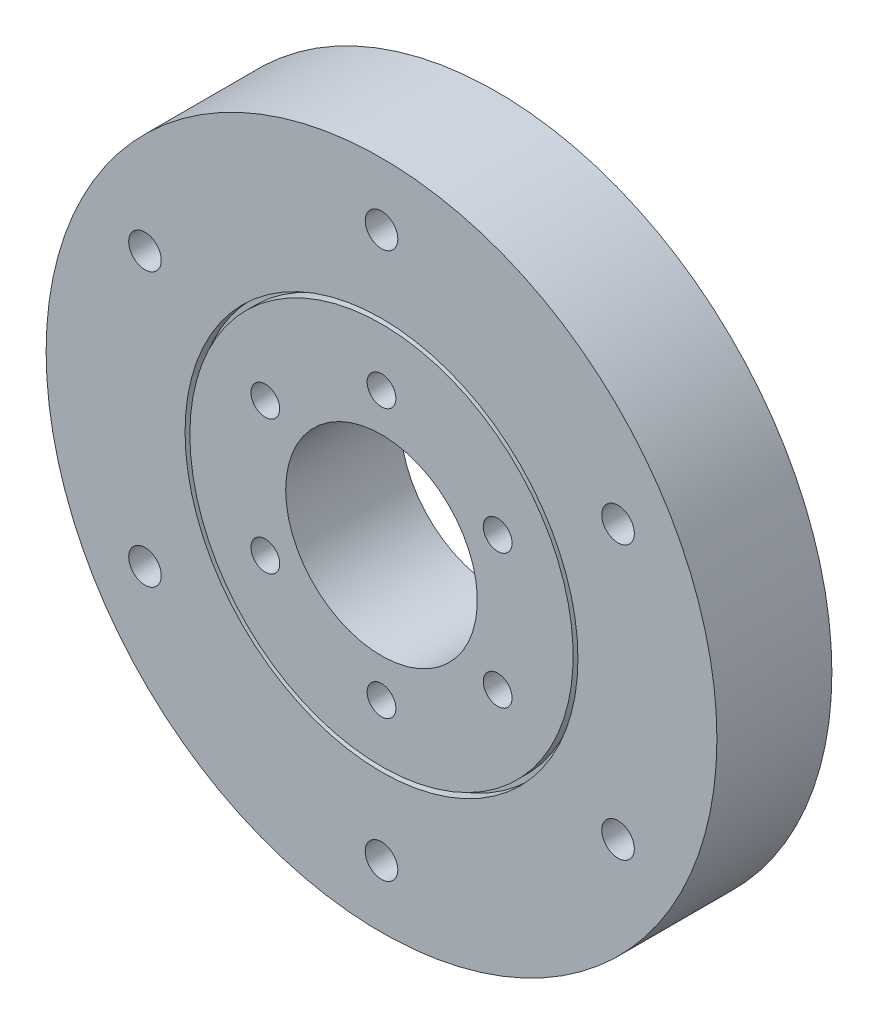
ISO-10303-21;
HEADER;
FILE_DESCRIPTION(('STEP AP214'),'2;1');
FILE_NAME('part.step','',(''),(''),'','','');
FILE_SCHEMA(('AUTOMOTIVE_DESIGN { 1 0 10303 214 1 1 1 1 }'));
ENDSEC;
DATA;
#1=APPLICATION_CONTEXT('core data for automotive mechanical design processes');
#2=APPLICATION_PROTOCOL_DEFINITION('international standard','automotive_design',2000,#1);
#3=PRODUCT_CONTEXT('',#1,'mechanical');
#4=PRODUCT('Part','Part','',(#3));
#5=PRODUCT_RELATED_PRODUCT_CATEGORY('part','',(#4));
#6=PRODUCT_DEFINITION_FORMATION('','',#4);
#7=PRODUCT_DEFINITION_CONTEXT('part definition',#1,'design');
#8=PRODUCT_DEFINITION('design','',#6,#7);
#9=PRODUCT_DEFINITION_SHAPE('','',#8);
#10=(LENGTH_UNIT() NAMED_UNIT(*) SI_UNIT(.MILLI.,.METRE.));
#11=(NAMED_UNIT(*) PLANE_ANGLE_UNIT() SI_UNIT($,.RADIAN.));
#12=(NAMED_UNIT(*) SI_UNIT($,.STERADIAN.) SOLID_ANGLE_UNIT());
#13=UNCERTAINTY_MEASURE_WITH_UNIT(LENGTH_MEASURE(1.E-05),#10,'distance_accuracy_value','');
#14=(GEOMETRIC_REPRESENTATION_CONTEXT(3) GLOBAL_UNCERTAINTY_ASSIGNED_CONTEXT((#13)) GLOBAL_UNIT_ASSIGNED_CONTEXT((#10,
#11,#12)) REPRESENTATION_CONTEXT('',''));
#15=CARTESIAN_POINT('',(0.,0.,0.));
#16=DIRECTION('',(0.,0.,1.));
#17=DIRECTION('',(1.,0.,0.));
#18=AXIS2_PLACEMENT_3D('',#15,#16,#17);
#19=CARTESIAN_POINT('',(0.,0.,-11.2234597048574));
#20=DIRECTION('',(0.,0.,-1.));
#21=DIRECTION('',(-1.,0.,0.));
#22=AXIS2_PLACEMENT_3D('',#19,#20,#21);
#23=CYLINDRICAL_SURFACE('',#22,35.);
#24=CARTESIAN_POINT('',(0.,0.,-6.));
#25=DIRECTION('',(0.,0.,-1.));
#26=DIRECTION('',(-1.,0.,0.));
#27=AXIS2_PLACEMENT_3D('',#24,#25,#26);
#28=CIRCLE('',#27,35.);
#29=CARTESIAN_POINT('',(-35.,0.,-6.));
#30=VERTEX_POINT('',#29);
#31=EDGE_CURVE('E10',#30,#30,#28,.T.);
#32=ORIENTED_EDGE('',*,*,#31,.F.);
#33=EDGE_LOOP('',(#32));
#34=FACE_BOUND('',#33,.T.);
#35=CARTESIAN_POINT('',(0.,0.,6.));
#36=DIRECTION('',(0.,0.,-1.));
#37=DIRECTION('',(-1.,0.,0.));
#38=AXIS2_PLACEMENT_3D('',#35,#36,#37);
#39=CIRCLE('',#38,35.);
#40=CARTESIAN_POINT('',(-35.,0.,6.));
#41=VERTEX_POINT('',#40);
#42=EDGE_CURVE('E73',#41,#41,#39,.T.);
#43=ORIENTED_EDGE('',*,*,#42,.T.);
#44=EDGE_LOOP('',(#43));
#45=FACE_BOUND('',#44,.T.);
#46=ADVANCED_FACE('F33',(#34,#45),#23,.T.);
#47=CARTESIAN_POINT('',(20.5,0.,-6.));
#48=DIRECTION('',(0.,0.,1.));
#49=DIRECTION('',(1.,0.,0.));
#50=AXIS2_PLACEMENT_3D('',#47,#48,#49);
#51=PLANE('',#50);
#52=CARTESIAN_POINT('',(0.,28.5,-6.));
#53=DIRECTION('',(0.,0.,-1.));
#54=DIRECTION('',(-1.,0.,0.));
#55=AXIS2_PLACEMENT_3D('',#52,#53,#54);
#56=CIRCLE('',#55,1.7);
#57=CARTESIAN_POINT('',(-1.7,28.5,-6.));
#58=VERTEX_POINT('',#57);
#59=EDGE_CURVE('E100',#58,#58,#56,.T.);
#60=ORIENTED_EDGE('',*,*,#59,.F.);
#61=EDGE_LOOP('',(#60));
#62=FACE_BOUND('',#61,.T.);
#63=CARTESIAN_POINT('',(24.6817240078559,14.2499999999989,-6.));
#64=DIRECTION('',(0.,0.,-1.));
#65=DIRECTION('',(-1.,0.,0.));
#66=AXIS2_PLACEMENT_3D('',#63,#64,#65);
#67=CIRCLE('',#66,1.70000000000122);
#68=CARTESIAN_POINT('',(22.9817240078547,14.2499999999989,-6.));
#69=VERTEX_POINT('',#68);
#70=EDGE_CURVE('E131',#69,#69,#67,.T.);
#71=ORIENTED_EDGE('',*,*,#70,.F.);
#72=EDGE_LOOP('',(#71));
#73=FACE_BOUND('',#72,.T.);
#74=CARTESIAN_POINT('',(24.6817240078547,-14.2500000000011,-6.));
#75=DIRECTION('',(0.,0.,-1.));
#76=DIRECTION('',(-1.,0.,0.));
#77=AXIS2_PLACEMENT_3D('',#74,#75,#76);
#78=CIRCLE('',#77,1.7000000000023);
#79=CARTESIAN_POINT('',(22.9817240078524,-14.2500000000011,-6.));
#80=VERTEX_POINT('',#79);
#81=EDGE_CURVE('E130',#80,#80,#78,.T.);
#82=ORIENTED_EDGE('',*,*,#81,.F.);
#83=EDGE_LOOP('',(#82));
#84=FACE_BOUND('',#83,.T.);
#85=CARTESIAN_POINT('',(-2.41958542616683E-12,-28.5,-6.));
#86=DIRECTION('',(0.,0.,-1.));
#87=DIRECTION('',(-1.,0.,0.));
#88=AXIS2_PLACEMENT_3D('',#85,#86,#87);
#89=CIRCLE('',#88,1.7000000000025);
#90=CARTESIAN_POINT('',(-1.70000000000492,-28.5,-6.));
#91=VERTEX_POINT('',#90);
#92=EDGE_CURVE('E137',#91,#91,#89,.T.);
#93=ORIENTED_EDGE('',*,*,#92,.F.);
#94=EDGE_LOOP('',(#93));
#95=FACE_BOUND('',#94,.T.);
#96=CARTESIAN_POINT('',(-24.6817240078571,14.2500000000011,-6.));
#97=DIRECTION('',(0.,0.,-1.));
#98=DIRECTION('',(-1.,0.,0.));
#99=AXIS2_PLACEMENT_3D('',#96,#97,#98);
#100=CIRCLE('',#99,1.70000000000034);
#101=CARTESIAN_POINT('',(-26.3817240078574,14.2500000000011,-6.));
#102=VERTEX_POINT('',#101);
#103=EDGE_CURVE('E106',#102,#102,#100,.T.);
#104=ORIENTED_EDGE('',*,*,#103,.F.);
#105=EDGE_LOOP('',(#104));
#106=FACE_BOUND('',#105,.T.);
#107=CARTESIAN_POINT('',(-24.6817240078583,-14.2499999999989,-6.));
#108=DIRECTION('',(0.,0.,-1.));
#109=DIRECTION('',(-1.,0.,0.));
#110=AXIS2_PLACEMENT_3D('',#107,#108,#109);
#111=CIRCLE('',#110,1.70000000000156);
#112=CARTESIAN_POINT('',(-26.3817240078599,-14.2499999999989,-6.));
#113=VERTEX_POINT('',#112);
#114=EDGE_CURVE('E107',#113,#113,#111,.T.);
#115=ORIENTED_EDGE('',*,*,#114,.F.);
#116=EDGE_LOOP('',(#115));
#117=FACE_BOUND('',#116,.T.);
#118=CARTESIAN_POINT('',(0.,0.,-6.));
#119=DIRECTION('',(0.,0.,-1.));
#120=DIRECTION('',(-1.,0.,0.));
#121=AXIS2_PLACEMENT_3D('',#118,#119,#120);
#122=CIRCLE('',#121,20.5);
#123=CARTESIAN_POINT('',(-20.5,0.,-6.));
#124=VERTEX_POINT('',#123);
#125=EDGE_CURVE('E39',#124,#124,#122,.T.);
#126=ORIENTED_EDGE('',*,*,#125,.F.);
#127=EDGE_LOOP('',(#126));
#128=FACE_BOUND('',#127,.T.);
#129=ORIENTED_EDGE('',*,*,#31,.T.);
#130=EDGE_LOOP('',(#129));
#131=FACE_BOUND('',#130,.T.);
#132=ADVANCED_FACE('F152',(#62,#73,#84,#95,#106,#117,#128,#131),#51,.F.);
#133=CARTESIAN_POINT('',(0.,0.,-11.2234597048574));
#134=DIRECTION('',(0.,0.,-1.));
#135=DIRECTION('',(-1.,0.,0.));
#136=AXIS2_PLACEMENT_3D('',#133,#134,#135);
#137=CYLINDRICAL_SURFACE('',#136,20.5);
#138=CARTESIAN_POINT('',(0.,0.,-5.));
#139=DIRECTION('',(0.,0.,-1.));
#140=DIRECTION('',(-1.,0.,0.));
#141=AXIS2_PLACEMENT_3D('',#138,#139,#140);
#142=CIRCLE('',#141,20.5);
#143=CARTESIAN_POINT('',(-20.5,0.,-5.));
#144=VERTEX_POINT('',#143);
#145=EDGE_CURVE('E43',#144,#144,#142,.T.);
#146=ORIENTED_EDGE('',*,*,#145,.F.);
#147=EDGE_LOOP('',(#146));
#148=FACE_BOUND('',#147,.T.);
#149=ORIENTED_EDGE('',*,*,#125,.T.);
#150=EDGE_LOOP('',(#149));
#151=FACE_BOUND('',#150,.T.);
#152=ADVANCED_FACE('F155',(#148,#151),#137,.F.);
#153=CARTESIAN_POINT('',(20.,0.,-5.));
#154=DIRECTION('',(0.,0.,1.));
#155=DIRECTION('',(1.,0.,0.));
#156=AXIS2_PLACEMENT_3D('',#153,#154,#155);
#157=PLANE('',#156);
#158=CARTESIAN_POINT('',(0.,0.,-5.));
#159=DIRECTION('',(0.,0.,-1.));
#160=DIRECTION('',(-1.,0.,0.));
#161=AXIS2_PLACEMENT_3D('',#158,#159,#160);
#162=CIRCLE('',#161,20.);
#163=CARTESIAN_POINT('',(-20.,0.,-5.));
#164=VERTEX_POINT('',#163);
#165=EDGE_CURVE('E47',#164,#164,#162,.T.);
#166=ORIENTED_EDGE('',*,*,#165,.F.);
#167=EDGE_LOOP('',(#166));
#168=FACE_BOUND('',#167,.T.);
#169=ORIENTED_EDGE('',*,*,#145,.T.);
#170=EDGE_LOOP('',(#169));
#171=FACE_BOUND('',#170,.T.);
#172=ADVANCED_FACE('F224',(#168,#171),#157,.F.);
#173=CARTESIAN_POINT('',(0.,0.,-11.2234597048574));
#174=DIRECTION('',(0.,0.,-1.));
#175=DIRECTION('',(-1.,0.,0.));
#176=AXIS2_PLACEMENT_3D('',#173,#174,#175);
#177=CYLINDRICAL_SURFACE('',#176,20.);
#178=CARTESIAN_POINT('',(0.,0.,-6.));
#179=DIRECTION('',(0.,0.,-1.));
#180=DIRECTION('',(-1.,0.,0.));
#181=AXIS2_PLACEMENT_3D('',#178,#179,#180);
#182=CIRCLE('',#181,20.);
#183=CARTESIAN_POINT('',(-20.,0.,-6.));
#184=VERTEX_POINT('',#183);
#185=EDGE_CURVE('E52',#184,#184,#182,.T.);
#186=ORIENTED_EDGE('',*,*,#185,.F.);
#187=EDGE_LOOP('',(#186));
#188=FACE_BOUND('',#187,.T.);
#189=ORIENTED_EDGE('',*,*,#165,.T.);
#190=EDGE_LOOP('',(#189));
#191=FACE_BOUND('',#190,.T.);
#192=ADVANCED_FACE('F217',(#188,#191),#177,.T.);
#193=CARTESIAN_POINT('',(10.,0.,-6.));
#194=DIRECTION('',(0.,0.,1.));
#195=DIRECTION('',(1.,0.,0.));
#196=AXIS2_PLACEMENT_3D('',#193,#194,#195);
#197=PLANE('',#196);
#198=CARTESIAN_POINT('',(0.,14.,-6.));
#199=DIRECTION('',(0.,0.,-1.));
#200=DIRECTION('',(-1.,0.,0.));
#201=AXIS2_PLACEMENT_3D('',#198,#199,#200);
#202=CIRCLE('',#201,1.5);
#203=CARTESIAN_POINT('',(-1.5,14.,-6.));
#204=VERTEX_POINT('',#203);
#205=EDGE_CURVE('E94',#204,#204,#202,.T.);
#206=ORIENTED_EDGE('',*,*,#205,.F.);
#207=EDGE_LOOP('',(#206));
#208=FACE_BOUND('',#207,.T.);
#209=CARTESIAN_POINT('',(-12.1243556529822,6.99999999999997,-6.));
#210=DIRECTION('',(0.,0.,-1.));
#211=DIRECTION('',(-1.,0.,0.));
#212=AXIS2_PLACEMENT_3D('',#209,#210,#211);
#213=CIRCLE('',#212,1.5);
#214=CARTESIAN_POINT('',(-13.6243556529822,6.99999999999997,-6.));
#215=VERTEX_POINT('',#214);
#216=EDGE_CURVE('E88',#215,#215,#213,.T.);
#217=ORIENTED_EDGE('',*,*,#216,.F.);
#218=EDGE_LOOP('',(#217));
#219=FACE_BOUND('',#218,.T.);
#220=CARTESIAN_POINT('',(-12.124355652983,-6.99999999999948,-6.));
#221=DIRECTION('',(0.,0.,-1.));
#222=DIRECTION('',(-1.,0.,0.));
#223=AXIS2_PLACEMENT_3D('',#220,#221,#222);
#224=CIRCLE('',#223,1.50000000000077);
#225=CARTESIAN_POINT('',(-13.6243556529838,-6.99999999999948,-6.));
#226=VERTEX_POINT('',#225);
#227=EDGE_CURVE('E80',#226,#226,#224,.T.);
#228=ORIENTED_EDGE('',*,*,#227,.F.);
#229=EDGE_LOOP('',(#228));
#230=FACE_BOUND('',#229,.T.);
#231=CARTESIAN_POINT('',(-1.18856827952055E-12,-14.,-6.));
#232=DIRECTION('',(0.,0.,-1.));
#233=DIRECTION('',(-1.,0.,0.));
#234=AXIS2_PLACEMENT_3D('',#231,#232,#233);
#235=CIRCLE('',#234,1.50000000000123);
#236=CARTESIAN_POINT('',(-1.50000000000242,-14.,-6.));
#237=VERTEX_POINT('',#236);
#238=EDGE_CURVE('E81',#237,#237,#235,.T.);
#239=ORIENTED_EDGE('',*,*,#238,.F.);
#240=EDGE_LOOP('',(#239));
#241=FACE_BOUND('',#240,.T.);
#242=CARTESIAN_POINT('',(12.1243556529812,-7.00000000000052,-6.));
#243=DIRECTION('',(0.,0.,-1.));
#244=DIRECTION('',(-1.,0.,0.));
#245=AXIS2_PLACEMENT_3D('',#242,#243,#244);
#246=CIRCLE('',#245,1.50000000000113);
#247=CARTESIAN_POINT('',(10.6243556529801,-7.00000000000052,-6.));
#248=VERTEX_POINT('',#247);
#249=EDGE_CURVE('E120',#248,#248,#246,.T.);
#250=ORIENTED_EDGE('',*,*,#249,.F.);
#251=EDGE_LOOP('',(#250));
#252=FACE_BOUND('',#251,.T.);
#253=CARTESIAN_POINT('',(12.1243556529819,6.99999999999948,-6.));
#254=DIRECTION('',(0.,0.,-1.));
#255=DIRECTION('',(-1.,0.,0.));
#256=AXIS2_PLACEMENT_3D('',#253,#254,#255);
#257=CIRCLE('',#256,1.5000000000006);
#258=CARTESIAN_POINT('',(10.6243556529813,6.99999999999948,-6.));
#259=VERTEX_POINT('',#258);
#260=EDGE_CURVE('E114',#259,#259,#257,.T.);
#261=ORIENTED_EDGE('',*,*,#260,.F.);
#262=EDGE_LOOP('',(#261));
#263=FACE_BOUND('',#262,.T.);
#264=CARTESIAN_POINT('',(0.,0.,-6.));
#265=DIRECTION('',(0.,0.,-1.));
#266=DIRECTION('',(-1.,0.,0.));
#267=AXIS2_PLACEMENT_3D('',#264,#265,#266);
#268=CIRCLE('',#267,10.);
#269=CARTESIAN_POINT('',(-10.,0.,-6.));
#270=VERTEX_POINT('',#269);
#271=EDGE_CURVE('E55',#270,#270,#268,.T.);
#272=ORIENTED_EDGE('',*,*,#271,.F.);
#273=EDGE_LOOP('',(#272));
#274=FACE_BOUND('',#273,.T.);
#275=ORIENTED_EDGE('',*,*,#185,.T.);
#276=EDGE_LOOP('',(#275));
#277=FACE_BOUND('',#276,.T.);
#278=ADVANCED_FACE('F211',(#208,#219,#230,#241,#252,#263,#274,#277),#197,.F.);
#279=CARTESIAN_POINT('',(0.,0.,-11.2234597048574));
#280=DIRECTION('',(0.,0.,-1.));
#281=DIRECTION('',(-1.,0.,0.));
#282=AXIS2_PLACEMENT_3D('',#279,#280,#281);
#283=CYLINDRICAL_SURFACE('',#282,10.);
#284=CARTESIAN_POINT('',(0.,0.,5.99999999999999));
#285=DIRECTION('',(0.,0.,-1.));
#286=DIRECTION('',(-1.,0.,0.));
#287=AXIS2_PLACEMENT_3D('',#284,#285,#286);
#288=CIRCLE('',#287,10.);
#289=CARTESIAN_POINT('',(-10.,0.,5.99999999999999));
#290=VERTEX_POINT('',#289);
#291=EDGE_CURVE('E58',#290,#290,#288,.T.);
#292=ORIENTED_EDGE('',*,*,#291,.F.);
#293=EDGE_LOOP('',(#292));
#294=FACE_BOUND('',#293,.T.);
#295=ORIENTED_EDGE('',*,*,#271,.T.);
#296=EDGE_LOOP('',(#295));
#297=FACE_BOUND('',#296,.T.);
#298=ADVANCED_FACE('F204',(#294,#297),#283,.F.);
#299=CARTESIAN_POINT('',(10.,0.,6.));
#300=DIRECTION('',(0.,0.,-1.));
#301=DIRECTION('',(-1.,0.,0.));
#302=AXIS2_PLACEMENT_3D('',#299,#300,#301);
#303=PLANE('',#302);
#304=CARTESIAN_POINT('',(0.,14.,6.));
#305=DIRECTION('',(0.,0.,-1.));
#306=DIRECTION('',(-1.,0.,0.));
#307=AXIS2_PLACEMENT_3D('',#304,#305,#306);
#308=CIRCLE('',#307,1.5);
#309=CARTESIAN_POINT('',(-1.5,14.,6.));
#310=VERTEX_POINT('',#309);
#311=EDGE_CURVE('E97',#310,#310,#308,.F.);
#312=ORIENTED_EDGE('',*,*,#311,.F.);
#313=EDGE_LOOP('',(#312));
#314=FACE_BOUND('',#313,.T.);
#315=CARTESIAN_POINT('',(-12.1243556529822,6.99999999999997,6.));
#316=DIRECTION('',(0.,0.,-1.));
#317=DIRECTION('',(-1.,0.,0.));
#318=AXIS2_PLACEMENT_3D('',#315,#316,#317);
#319=CIRCLE('',#318,1.5);
#320=CARTESIAN_POINT('',(-13.6243556529822,6.99999999999997,6.));
#321=VERTEX_POINT('',#320);
#322=EDGE_CURVE('E91',#321,#321,#319,.F.);
#323=ORIENTED_EDGE('',*,*,#322,.F.);
#324=EDGE_LOOP('',(#323));
#325=FACE_BOUND('',#324,.T.);
#326=CARTESIAN_POINT('',(-12.124355652983,-6.99999999999948,6.));
#327=DIRECTION('',(0.,0.,-1.));
#328=DIRECTION('',(-1.,0.,0.));
#329=AXIS2_PLACEMENT_3D('',#326,#327,#328);
#330=CIRCLE('',#329,1.50000000000077);
#331=CARTESIAN_POINT('',(-13.6243556529838,-6.99999999999948,6.));
#332=VERTEX_POINT('',#331);
#333=EDGE_CURVE('E85',#332,#332,#330,.F.);
#334=ORIENTED_EDGE('',*,*,#333,.F.);
#335=EDGE_LOOP('',(#334));
#336=FACE_BOUND('',#335,.T.);
#337=CARTESIAN_POINT('',(-1.18856827952055E-12,-14.,6.));
#338=DIRECTION('',(0.,0.,-1.));
#339=DIRECTION('',(-1.,0.,0.));
#340=AXIS2_PLACEMENT_3D('',#337,#338,#339);
#341=CIRCLE('',#340,1.50000000000123);
#342=CARTESIAN_POINT('',(-1.50000000000242,-14.,6.));
#343=VERTEX_POINT('',#342);
#344=EDGE_CURVE('E77',#343,#343,#341,.F.);
#345=ORIENTED_EDGE('',*,*,#344,.F.);
#346=EDGE_LOOP('',(#345));
#347=FACE_BOUND('',#346,.T.);
#348=CARTESIAN_POINT('',(12.1243556529812,-7.00000000000052,6.));
#349=DIRECTION('',(0.,0.,-1.));
#350=DIRECTION('',(-1.,0.,0.));
#351=AXIS2_PLACEMENT_3D('',#348,#349,#350);
#352=CIRCLE('',#351,1.50000000000113);
#353=CARTESIAN_POINT('',(10.6243556529801,-7.00000000000052,6.));
#354=VERTEX_POINT('',#353);
#355=EDGE_CURVE('E84',#354,#354,#352,.F.);
#356=ORIENTED_EDGE('',*,*,#355,.F.);
#357=EDGE_LOOP('',(#356));
#358=FACE_BOUND('',#357,.T.);
#359=CARTESIAN_POINT('',(12.1243556529819,6.99999999999948,6.));
#360=DIRECTION('',(0.,0.,-1.));
#361=DIRECTION('',(-1.,0.,0.));
#362=AXIS2_PLACEMENT_3D('',#359,#360,#361);
#363=CIRCLE('',#362,1.5000000000006);
#364=CARTESIAN_POINT('',(10.6243556529813,6.99999999999948,6.));
#365=VERTEX_POINT('',#364);
#366=EDGE_CURVE('E117',#365,#365,#363,.F.);
#367=ORIENTED_EDGE('',*,*,#366,.F.);
#368=EDGE_LOOP('',(#367));
#369=FACE_BOUND('',#368,.T.);
#370=CARTESIAN_POINT('',(0.,0.,5.99999999999999));
#371=DIRECTION('',(0.,0.,-1.));
#372=DIRECTION('',(-1.,0.,0.));
#373=AXIS2_PLACEMENT_3D('',#370,#371,#372);
#374=CIRCLE('',#373,20.);
#375=CARTESIAN_POINT('',(-20.,0.,5.99999999999999));
#376=VERTEX_POINT('',#375);
#377=EDGE_CURVE('E61',#376,#376,#374,.T.);
#378=ORIENTED_EDGE('',*,*,#377,.F.);
#379=EDGE_LOOP('',(#378));
#380=FACE_BOUND('',#379,.T.);
#381=ORIENTED_EDGE('',*,*,#291,.T.);
#382=EDGE_LOOP('',(#381));
#383=FACE_BOUND('',#382,.T.);
#384=ADVANCED_FACE('F198',(#314,#325,#336,#347,#358,#369,#380,#383),#303,.F.);
#385=CARTESIAN_POINT('',(0.,0.,-11.2234597048574));
#386=DIRECTION('',(0.,0.,-1.));
#387=DIRECTION('',(-1.,0.,0.));
#388=AXIS2_PLACEMENT_3D('',#385,#386,#387);
#389=CYLINDRICAL_SURFACE('',#388,20.);
#390=CARTESIAN_POINT('',(0.,0.,5.));
#391=DIRECTION('',(0.,0.,-1.));
#392=DIRECTION('',(-1.,0.,0.));
#393=AXIS2_PLACEMENT_3D('',#390,#391,#392);
#394=CIRCLE('',#393,20.);
#395=CARTESIAN_POINT('',(-20.,0.,5.));
#396=VERTEX_POINT('',#395);
#397=EDGE_CURVE('E64',#396,#396,#394,.T.);
#398=ORIENTED_EDGE('',*,*,#397,.F.);
#399=EDGE_LOOP('',(#398));
#400=FACE_BOUND('',#399,.T.);
#401=ORIENTED_EDGE('',*,*,#377,.T.);
#402=EDGE_LOOP('',(#401));
#403=FACE_BOUND('',#402,.T.);
#404=ADVANCED_FACE('F192',(#400,#403),#389,.T.);
#405=CARTESIAN_POINT('',(20.,0.,5.));
#406=DIRECTION('',(0.,0.,-1.));
#407=DIRECTION('',(-1.,0.,0.));
#408=AXIS2_PLACEMENT_3D('',#405,#406,#407);
#409=PLANE('',#408);
#410=CARTESIAN_POINT('',(0.,0.,5.));
#411=DIRECTION('',(0.,0.,-1.));
#412=DIRECTION('',(-1.,0.,0.));
#413=AXIS2_PLACEMENT_3D('',#410,#411,#412);
#414=CIRCLE('',#413,20.5);
#415=CARTESIAN_POINT('',(-20.5,0.,5.));
#416=VERTEX_POINT('',#415);
#417=EDGE_CURVE('E67',#416,#416,#414,.T.);
#418=ORIENTED_EDGE('',*,*,#417,.F.);
#419=EDGE_LOOP('',(#418));
#420=FACE_BOUND('',#419,.T.);
#421=ORIENTED_EDGE('',*,*,#397,.T.);
#422=EDGE_LOOP('',(#421));
#423=FACE_BOUND('',#422,.T.);
#424=ADVANCED_FACE('F186',(#420,#423),#409,.F.);
#425=CARTESIAN_POINT('',(0.,0.,-11.2234597048574));
#426=DIRECTION('',(0.,0.,-1.));
#427=DIRECTION('',(-1.,0.,0.));
#428=AXIS2_PLACEMENT_3D('',#425,#426,#427);
#429=CYLINDRICAL_SURFACE('',#428,20.5);
#430=CARTESIAN_POINT('',(0.,0.,6.));
#431=DIRECTION('',(0.,0.,-1.));
#432=DIRECTION('',(-1.,0.,0.));
#433=AXIS2_PLACEMENT_3D('',#430,#431,#432);
#434=CIRCLE('',#433,20.5);
#435=CARTESIAN_POINT('',(-20.5,0.,6.));
#436=VERTEX_POINT('',#435);
#437=EDGE_CURVE('E70',#436,#436,#434,.T.);
#438=ORIENTED_EDGE('',*,*,#437,.F.);
#439=EDGE_LOOP('',(#438));
#440=FACE_BOUND('',#439,.T.);
#441=ORIENTED_EDGE('',*,*,#417,.T.);
#442=EDGE_LOOP('',(#441));
#443=FACE_BOUND('',#442,.T.);
#444=ADVANCED_FACE('F177',(#440,#443),#429,.F.);
#445=CARTESIAN_POINT('',(20.5,0.,6.));
#446=DIRECTION('',(0.,0.,-1.));
#447=DIRECTION('',(-1.,0.,0.));
#448=AXIS2_PLACEMENT_3D('',#445,#446,#447);
#449=PLANE('',#448);
#450=CARTESIAN_POINT('',(0.,28.5,6.));
#451=DIRECTION('',(0.,0.,-1.));
#452=DIRECTION('',(-1.,0.,0.));
#453=AXIS2_PLACEMENT_3D('',#450,#451,#452);
#454=CIRCLE('',#453,1.7);
#455=CARTESIAN_POINT('',(-1.7,28.5,6.));
#456=VERTEX_POINT('',#455);
#457=EDGE_CURVE('E76',#456,#456,#454,.F.);
#458=ORIENTED_EDGE('',*,*,#457,.F.);
#459=EDGE_LOOP('',(#458));
#460=FACE_BOUND('',#459,.T.);
#461=CARTESIAN_POINT('',(24.6817240078559,14.2499999999989,6.));
#462=DIRECTION('',(0.,0.,-1.));
#463=DIRECTION('',(-1.,0.,0.));
#464=AXIS2_PLACEMENT_3D('',#461,#462,#463);
#465=CIRCLE('',#464,1.70000000000122);
#466=CARTESIAN_POINT('',(22.9817240078547,14.2499999999989,6.));
#467=VERTEX_POINT('',#466);
#468=EDGE_CURVE('E127',#467,#467,#465,.F.);
#469=ORIENTED_EDGE('',*,*,#468,.F.);
#470=EDGE_LOOP('',(#469));
#471=FACE_BOUND('',#470,.T.);
#472=CARTESIAN_POINT('',(24.6817240078547,-14.2500000000011,6.));
#473=DIRECTION('',(0.,0.,-1.));
#474=DIRECTION('',(-1.,0.,0.));
#475=AXIS2_PLACEMENT_3D('',#472,#473,#474);
#476=CIRCLE('',#475,1.7000000000023);
#477=CARTESIAN_POINT('',(22.9817240078524,-14.2500000000011,6.));
#478=VERTEX_POINT('',#477);
#479=EDGE_CURVE('E134',#478,#478,#476,.F.);
#480=ORIENTED_EDGE('',*,*,#479,.F.);
#481=EDGE_LOOP('',(#480));
#482=FACE_BOUND('',#481,.T.);
#483=CARTESIAN_POINT('',(-2.41958542616683E-12,-28.5,6.));
#484=DIRECTION('',(0.,0.,-1.));
#485=DIRECTION('',(-1.,0.,0.));
#486=AXIS2_PLACEMENT_3D('',#483,#484,#485);
#487=CIRCLE('',#486,1.7000000000025);
#488=CARTESIAN_POINT('',(-1.70000000000492,-28.5,6.));
#489=VERTEX_POINT('',#488);
#490=EDGE_CURVE('E110',#489,#489,#487,.F.);
#491=ORIENTED_EDGE('',*,*,#490,.F.);
#492=EDGE_LOOP('',(#491));
#493=FACE_BOUND('',#492,.T.);
#494=CARTESIAN_POINT('',(-24.6817240078571,14.2500000000011,6.));
#495=DIRECTION('',(0.,0.,-1.));
#496=DIRECTION('',(-1.,0.,0.));
#497=AXIS2_PLACEMENT_3D('',#494,#495,#496);
#498=CIRCLE('',#497,1.70000000000034);
#499=CARTESIAN_POINT('',(-26.3817240078574,14.2500000000011,6.));
#500=VERTEX_POINT('',#499);
#501=EDGE_CURVE('E111',#500,#500,#498,.F.);
#502=ORIENTED_EDGE('',*,*,#501,.F.);
#503=EDGE_LOOP('',(#502));
#504=FACE_BOUND('',#503,.T.);
#505=CARTESIAN_POINT('',(-24.6817240078583,-14.2499999999989,6.));
#506=DIRECTION('',(0.,0.,-1.));
#507=DIRECTION('',(-1.,0.,0.));
#508=AXIS2_PLACEMENT_3D('',#505,#506,#507);
#509=CIRCLE('',#508,1.70000000000156);
#510=CARTESIAN_POINT('',(-26.3817240078599,-14.2499999999989,6.));
#511=VERTEX_POINT('',#510);
#512=EDGE_CURVE('E103',#511,#511,#509,.F.);
#513=ORIENTED_EDGE('',*,*,#512,.F.);
#514=EDGE_LOOP('',(#513));
#515=FACE_BOUND('',#514,.T.);
#516=ORIENTED_EDGE('',*,*,#42,.F.);
#517=EDGE_LOOP('',(#516));
#518=FACE_BOUND('',#517,.T.);
#519=ORIENTED_EDGE('',*,*,#437,.T.);
#520=EDGE_LOOP('',(#519));
#521=FACE_BOUND('',#520,.T.);
#522=ADVANCED_FACE('F171',(#460,#471,#482,#493,#504,#515,#518,#521),#449,.F.);
#523=CARTESIAN_POINT('',(-24.6817240078583,-14.2499999999989,6.001));
#524=DIRECTION('',(0.,0.,-1.));
#525=DIRECTION('',(-1.,0.,0.));
#526=AXIS2_PLACEMENT_3D('',#523,#524,#525);
#527=CYLINDRICAL_SURFACE('',#526,1.70000000000156);
#528=ORIENTED_EDGE('',*,*,#114,.T.);
#529=EDGE_LOOP('',(#528));
#530=FACE_BOUND('',#529,.T.);
#531=ORIENTED_EDGE('',*,*,#512,.T.);
#532=EDGE_LOOP('',(#531));
#533=FACE_BOUND('',#532,.T.);
#534=ADVANCED_FACE('F167',(#530,#533),#527,.F.);
#535=CARTESIAN_POINT('',(-24.6817240078571,14.2500000000011,6.001));
#536=DIRECTION('',(0.,0.,-1.));
#537=DIRECTION('',(-1.,0.,0.));
#538=AXIS2_PLACEMENT_3D('',#535,#536,#537);
#539=CYLINDRICAL_SURFACE('',#538,1.70000000000034);
#540=ORIENTED_EDGE('',*,*,#103,.T.);
#541=EDGE_LOOP('',(#540));
#542=FACE_BOUND('',#541,.T.);
#543=ORIENTED_EDGE('',*,*,#501,.T.);
#544=EDGE_LOOP('',(#543));
#545=FACE_BOUND('',#544,.T.);
#546=ADVANCED_FACE('F170',(#542,#545),#539,.F.);
#547=CARTESIAN_POINT('',(-2.41958542616683E-12,-28.5,6.001));
#548=DIRECTION('',(0.,0.,-1.));
#549=DIRECTION('',(-1.,0.,0.));
#550=AXIS2_PLACEMENT_3D('',#547,#548,#549);
#551=CYLINDRICAL_SURFACE('',#550,1.7000000000025);
#552=ORIENTED_EDGE('',*,*,#92,.T.);
#553=EDGE_LOOP('',(#552));
#554=FACE_BOUND('',#553,.T.);
#555=ORIENTED_EDGE('',*,*,#490,.T.);
#556=EDGE_LOOP('',(#555));
#557=FACE_BOUND('',#556,.T.);
#558=ADVANCED_FACE('F287',(#554,#557),#551,.F.);
#559=CARTESIAN_POINT('',(24.6817240078547,-14.2500000000011,6.001));
#560=DIRECTION('',(0.,0.,-1.));
#561=DIRECTION('',(-1.,0.,0.));
#562=AXIS2_PLACEMENT_3D('',#559,#560,#561);
#563=CYLINDRICAL_SURFACE('',#562,1.7000000000023);
#564=ORIENTED_EDGE('',*,*,#81,.T.);
#565=EDGE_LOOP('',(#564));
#566=FACE_BOUND('',#565,.T.);
#567=ORIENTED_EDGE('',*,*,#479,.T.);
#568=EDGE_LOOP('',(#567));
#569=FACE_BOUND('',#568,.T.);
#570=ADVANCED_FACE('F297',(#566,#569),#563,.F.);
#571=CARTESIAN_POINT('',(24.6817240078559,14.2499999999989,6.001));
#572=DIRECTION('',(0.,0.,-1.));
#573=DIRECTION('',(-1.,0.,0.));
#574=AXIS2_PLACEMENT_3D('',#571,#572,#573);
#575=CYLINDRICAL_SURFACE('',#574,1.70000000000122);
#576=ORIENTED_EDGE('',*,*,#70,.T.);
#577=EDGE_LOOP('',(#576));
#578=FACE_BOUND('',#577,.T.);
#579=ORIENTED_EDGE('',*,*,#468,.T.);
#580=EDGE_LOOP('',(#579));
#581=FACE_BOUND('',#580,.T.);
#582=ADVANCED_FACE('F307',(#578,#581),#575,.F.);
#583=CARTESIAN_POINT('',(0.,28.5,6.001));
#584=DIRECTION('',(0.,0.,-1.));
#585=DIRECTION('',(-1.,0.,0.));
#586=AXIS2_PLACEMENT_3D('',#583,#584,#585);
#587=CYLINDRICAL_SURFACE('',#586,1.7);
#588=ORIENTED_EDGE('',*,*,#59,.T.);
#589=EDGE_LOOP('',(#588));
#590=FACE_BOUND('',#589,.T.);
#591=ORIENTED_EDGE('',*,*,#457,.T.);
#592=EDGE_LOOP('',(#591));
#593=FACE_BOUND('',#592,.T.);
#594=ADVANCED_FACE('F149',(#590,#593),#587,.F.);
#595=CARTESIAN_POINT('',(12.1243556529819,6.99999999999948,6.001));
#596=DIRECTION('',(0.,0.,-1.));
#597=DIRECTION('',(-1.,0.,0.));
#598=AXIS2_PLACEMENT_3D('',#595,#596,#597);
#599=CYLINDRICAL_SURFACE('',#598,1.5000000000006);
#600=ORIENTED_EDGE('',*,*,#260,.T.);
#601=EDGE_LOOP('',(#600));
#602=FACE_BOUND('',#601,.T.);
#603=ORIENTED_EDGE('',*,*,#366,.T.);
#604=EDGE_LOOP('',(#603));
#605=FACE_BOUND('',#604,.T.);
#606=ADVANCED_FACE('F326',(#602,#605),#599,.F.);
#607=CARTESIAN_POINT('',(12.1243556529812,-7.00000000000052,6.001));
#608=DIRECTION('',(0.,0.,-1.));
#609=DIRECTION('',(-1.,0.,0.));
#610=AXIS2_PLACEMENT_3D('',#607,#608,#609);
#611=CYLINDRICAL_SURFACE('',#610,1.50000000000113);
#612=ORIENTED_EDGE('',*,*,#249,.T.);
#613=EDGE_LOOP('',(#612));
#614=FACE_BOUND('',#613,.T.);
#615=ORIENTED_EDGE('',*,*,#355,.T.);
#616=EDGE_LOOP('',(#615));
#617=FACE_BOUND('',#616,.T.);
#618=ADVANCED_FACE('F335',(#614,#617),#611,.F.);
#619=CARTESIAN_POINT('',(-1.18856827952055E-12,-14.,6.001));
#620=DIRECTION('',(0.,0.,-1.));
#621=DIRECTION('',(-1.,0.,0.));
#622=AXIS2_PLACEMENT_3D('',#619,#620,#621);
#623=CYLINDRICAL_SURFACE('',#622,1.50000000000123);
#624=ORIENTED_EDGE('',*,*,#238,.T.);
#625=EDGE_LOOP('',(#624));
#626=FACE_BOUND('',#625,.T.);
#627=ORIENTED_EDGE('',*,*,#344,.T.);
#628=EDGE_LOOP('',(#627));
#629=FACE_BOUND('',#628,.T.);
#630=ADVANCED_FACE('F345',(#626,#629),#623,.F.);
#631=CARTESIAN_POINT('',(-12.124355652983,-6.99999999999948,6.001));
#632=DIRECTION('',(0.,0.,-1.));
#633=DIRECTION('',(-1.,0.,0.));
#634=AXIS2_PLACEMENT_3D('',#631,#632,#633);
#635=CYLINDRICAL_SURFACE('',#634,1.50000000000077);
#636=ORIENTED_EDGE('',*,*,#227,.T.);
#637=EDGE_LOOP('',(#636));
#638=FACE_BOUND('',#637,.T.);
#639=ORIENTED_EDGE('',*,*,#333,.T.);
#640=EDGE_LOOP('',(#639));
#641=FACE_BOUND('',#640,.T.);
#642=ADVANCED_FACE('F355',(#638,#641),#635,.F.);
#643=CARTESIAN_POINT('',(-12.1243556529822,6.99999999999997,6.001));
#644=DIRECTION('',(0.,0.,-1.));
#645=DIRECTION('',(-1.,0.,0.));
#646=AXIS2_PLACEMENT_3D('',#643,#644,#645);
#647=CYLINDRICAL_SURFACE('',#646,1.5);
#648=ORIENTED_EDGE('',*,*,#216,.T.);
#649=EDGE_LOOP('',(#648));
#650=FACE_BOUND('',#649,.T.);
#651=ORIENTED_EDGE('',*,*,#322,.T.);
#652=EDGE_LOOP('',(#651));
#653=FACE_BOUND('',#652,.T.);
#654=ADVANCED_FACE('F365',(#650,#653),#647,.F.);
#655=CARTESIAN_POINT('',(0.,14.,6.001));
#656=DIRECTION('',(0.,0.,-1.));
#657=DIRECTION('',(-1.,0.,0.));
#658=AXIS2_PLACEMENT_3D('',#655,#656,#657);
#659=CYLINDRICAL_SURFACE('',#658,1.5);
#660=ORIENTED_EDGE('',*,*,#205,.T.);
#661=EDGE_LOOP('',(#660));
#662=FACE_BOUND('',#661,.T.);
#663=ORIENTED_EDGE('',*,*,#311,.T.);
#664=EDGE_LOOP('',(#663));
#665=FACE_BOUND('',#664,.T.);
#666=ADVANCED_FACE('F375',(#662,#665),#659,.F.);
#667=CLOSED_SHELL('',(#46,#132,#152,#172,#192,#278,#298,#384,#404,#424,#444,#522,#534,#546,#558,
#570,#582,#594,#606,#618,#630,#642,#654,#666));
#668=MANIFOLD_SOLID_BREP('B2',#667);
#669=ADVANCED_BREP_SHAPE_REPRESENTATION('',(#18,#668),#14);
#670=SHAPE_DEFINITION_REPRESENTATION(#9,#669);
ENDSEC;
END-ISO-10303-21;
